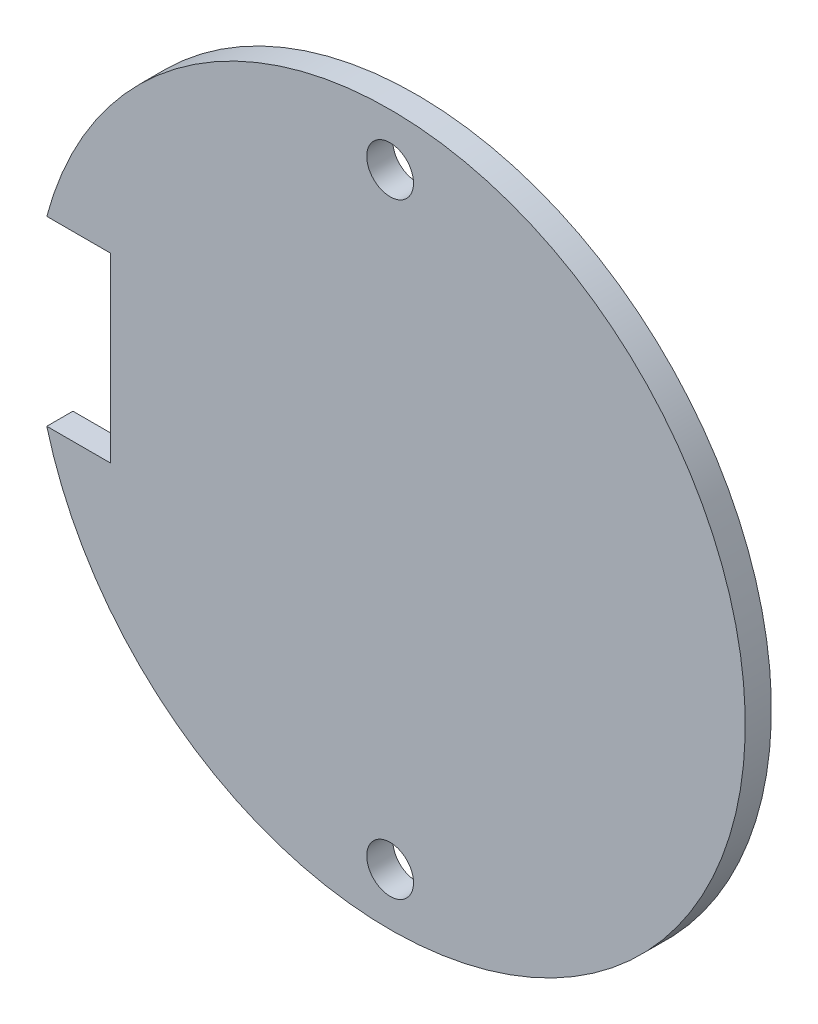
ISO-10303-21;
HEADER;
FILE_DESCRIPTION(('STEP AP214'),'2;1');
FILE_NAME('part.step','',(''),(''),'','','');
FILE_SCHEMA(('AUTOMOTIVE_DESIGN { 1 0 10303 214 1 1 1 1 }'));
ENDSEC;
DATA;
#1=APPLICATION_CONTEXT('core data for automotive mechanical design processes');
#2=APPLICATION_PROTOCOL_DEFINITION('international standard','automotive_design',2000,#1);
#3=PRODUCT_CONTEXT('',#1,'mechanical');
#4=PRODUCT('Part','Part','',(#3));
#5=PRODUCT_RELATED_PRODUCT_CATEGORY('part','',(#4));
#6=PRODUCT_DEFINITION_FORMATION('','',#4);
#7=PRODUCT_DEFINITION_CONTEXT('part definition',#1,'design');
#8=PRODUCT_DEFINITION('design','',#6,#7);
#9=PRODUCT_DEFINITION_SHAPE('','',#8);
#10=(LENGTH_UNIT() NAMED_UNIT(*) SI_UNIT(.MILLI.,.METRE.));
#11=(NAMED_UNIT(*) PLANE_ANGLE_UNIT() SI_UNIT($,.RADIAN.));
#12=(NAMED_UNIT(*) SI_UNIT($,.STERADIAN.) SOLID_ANGLE_UNIT());
#13=UNCERTAINTY_MEASURE_WITH_UNIT(LENGTH_MEASURE(1.E-05),#10,'distance_accuracy_value','');
#14=(GEOMETRIC_REPRESENTATION_CONTEXT(3) GLOBAL_UNCERTAINTY_ASSIGNED_CONTEXT((#13)) GLOBAL_UNIT_ASSIGNED_CONTEXT((#10,
#11,#12)) REPRESENTATION_CONTEXT('',''));
#15=CARTESIAN_POINT('',(0.,0.,0.));
#16=DIRECTION('',(0.,0.,1.));
#17=DIRECTION('',(1.,0.,0.));
#18=AXIS2_PLACEMENT_3D('',#15,#16,#17);
#19=CARTESIAN_POINT('',(0.,0.,1.5875));
#20=DIRECTION('',(0.,0.,1.));
#21=DIRECTION('',(1.,0.,0.));
#22=AXIS2_PLACEMENT_3D('',#19,#20,#21);
#23=PLANE('',#22);
#24=CARTESIAN_POINT('',(0.,18.415,1.5875));
#25=DIRECTION('',(0.,0.,1.));
#26=DIRECTION('',(1.,0.,0.));
#27=AXIS2_PLACEMENT_3D('',#24,#25,#26);
#28=CIRCLE('',#27,1.4224);
#29=CARTESIAN_POINT('',(1.42240000000001,18.415,1.5875));
#30=VERTEX_POINT('',#29);
#31=EDGE_CURVE('E100',#30,#30,#28,.T.);
#32=ORIENTED_EDGE('',*,*,#31,.F.);
#33=EDGE_LOOP('',(#32));
#34=FACE_BOUND('',#33,.T.);
#35=CARTESIAN_POINT('',(0.,0.,1.5875));
#36=DIRECTION('',(0.,0.,1.));
#37=DIRECTION('',(1.,0.,0.));
#38=AXIS2_PLACEMENT_3D('',#35,#36,#37);
#39=CIRCLE('',#38,21.59);
#40=CARTESIAN_POINT('',(-20.8712242034338,-5.52449999999999,1.5875));
#41=VERTEX_POINT('',#40);
#42=CARTESIAN_POINT('',(-20.8712242034338,5.5245,1.5875));
#43=VERTEX_POINT('',#42);
#44=EDGE_CURVE('E85',#41,#43,#39,.T.);
#45=ORIENTED_EDGE('',*,*,#44,.T.);
#46=DIRECTION('',(1.,0.,0.));
#47=VECTOR('',#46,1.);
#48=CARTESIAN_POINT('',(-20.8712242034338,5.5245,1.5875));
#49=LINE('',#48,#47);
#50=CARTESIAN_POINT('',(-16.9840587441892,5.5245,1.5875));
#51=VERTEX_POINT('',#50);
#52=EDGE_CURVE('E80',#43,#51,#49,.T.);
#53=ORIENTED_EDGE('',*,*,#52,.T.);
#54=DIRECTION('',(0.,-1.,0.));
#55=VECTOR('',#54,1.);
#56=CARTESIAN_POINT('',(-16.9840587441892,5.5245,1.5875));
#57=LINE('',#56,#55);
#58=CARTESIAN_POINT('',(-16.9840587441892,-5.5245,1.5875));
#59=VERTEX_POINT('',#58);
#60=EDGE_CURVE('E83',#51,#59,#57,.T.);
#61=ORIENTED_EDGE('',*,*,#60,.T.);
#62=DIRECTION('',(-1.,0.,0.));
#63=VECTOR('',#62,1.);
#64=CARTESIAN_POINT('',(-16.9840587441892,-5.5245,1.5875));
#65=LINE('',#64,#63);
#66=EDGE_CURVE('E50',#59,#41,#65,.T.);
#67=ORIENTED_EDGE('',*,*,#66,.T.);
#68=EDGE_LOOP('',(#45,#53,#61,#67));
#69=FACE_BOUND('',#68,.T.);
#70=CARTESIAN_POINT('',(0.,-18.415,1.5875));
#71=DIRECTION('',(0.,0.,1.));
#72=DIRECTION('',(1.,0.,0.));
#73=AXIS2_PLACEMENT_3D('',#70,#71,#72);
#74=CIRCLE('',#73,1.4224);
#75=CARTESIAN_POINT('',(1.42240000000001,-18.415,1.5875));
#76=VERTEX_POINT('',#75);
#77=EDGE_CURVE('E115',#76,#76,#74,.T.);
#78=ORIENTED_EDGE('',*,*,#77,.F.);
#79=EDGE_LOOP('',(#78));
#80=FACE_BOUND('',#79,.T.);
#81=ADVANCED_FACE('F33',(#34,#69,#80),#23,.T.);
#82=CARTESIAN_POINT('',(0.,0.,0.));
#83=DIRECTION('',(0.,0.,1.));
#84=DIRECTION('',(1.,0.,0.));
#85=AXIS2_PLACEMENT_3D('',#82,#83,#84);
#86=PLANE('',#85);
#87=CARTESIAN_POINT('',(0.,18.415,0.));
#88=DIRECTION('',(0.,0.,1.));
#89=DIRECTION('',(1.,0.,0.));
#90=AXIS2_PLACEMENT_3D('',#87,#88,#89);
#91=CIRCLE('',#90,1.4224);
#92=CARTESIAN_POINT('',(1.42240000000001,18.415,0.));
#93=VERTEX_POINT('',#92);
#94=EDGE_CURVE('E112',#93,#93,#91,.T.);
#95=ORIENTED_EDGE('',*,*,#94,.T.);
#96=EDGE_LOOP('',(#95));
#97=FACE_BOUND('',#96,.T.);
#98=CARTESIAN_POINT('',(0.,0.,0.));
#99=DIRECTION('',(0.,0.,1.));
#100=DIRECTION('',(1.,0.,0.));
#101=AXIS2_PLACEMENT_3D('',#98,#99,#100);
#102=CIRCLE('',#101,21.59);
#103=CARTESIAN_POINT('',(-20.8712242034338,-5.52449999999999,0.));
#104=VERTEX_POINT('',#103);
#105=CARTESIAN_POINT('',(-20.8712242034338,5.5245,0.));
#106=VERTEX_POINT('',#105);
#107=EDGE_CURVE('E97',#104,#106,#102,.T.);
#108=ORIENTED_EDGE('',*,*,#107,.F.);
#109=DIRECTION('',(-1.,0.,0.));
#110=VECTOR('',#109,1.);
#111=CARTESIAN_POINT('',(-16.9840587441892,-5.5245,0.));
#112=LINE('',#111,#110);
#113=CARTESIAN_POINT('',(-16.9840587441892,-5.5245,0.));
#114=VERTEX_POINT('',#113);
#115=EDGE_CURVE('E73',#114,#104,#112,.T.);
#116=ORIENTED_EDGE('',*,*,#115,.F.);
#117=DIRECTION('',(0.,-1.,0.));
#118=VECTOR('',#117,1.);
#119=CARTESIAN_POINT('',(-16.9840587441892,5.5245,0.));
#120=LINE('',#119,#118);
#121=CARTESIAN_POINT('',(-16.9840587441892,5.5245,0.));
#122=VERTEX_POINT('',#121);
#123=EDGE_CURVE('E67',#122,#114,#120,.T.);
#124=ORIENTED_EDGE('',*,*,#123,.F.);
#125=DIRECTION('',(1.,0.,0.));
#126=VECTOR('',#125,1.);
#127=CARTESIAN_POINT('',(-20.8712242034338,5.5245,0.));
#128=LINE('',#127,#126);
#129=EDGE_CURVE('E89',#106,#122,#128,.T.);
#130=ORIENTED_EDGE('',*,*,#129,.F.);
#131=EDGE_LOOP('',(#108,#116,#124,#130));
#132=FACE_BOUND('',#131,.T.);
#133=CARTESIAN_POINT('',(0.,-18.415,0.));
#134=DIRECTION('',(0.,0.,1.));
#135=DIRECTION('',(1.,0.,0.));
#136=AXIS2_PLACEMENT_3D('',#133,#134,#135);
#137=CIRCLE('',#136,1.4224);
#138=CARTESIAN_POINT('',(1.42240000000001,-18.415,0.));
#139=VERTEX_POINT('',#138);
#140=EDGE_CURVE('E118',#139,#139,#137,.T.);
#141=ORIENTED_EDGE('',*,*,#140,.T.);
#142=EDGE_LOOP('',(#141));
#143=FACE_BOUND('',#142,.T.);
#144=ADVANCED_FACE('F108',(#97,#132,#143),#86,.F.);
#145=CARTESIAN_POINT('',(0.,0.,1.5875));
#146=DIRECTION('',(0.,0.,-1.));
#147=DIRECTION('',(-1.,0.,0.));
#148=AXIS2_PLACEMENT_3D('',#145,#146,#147);
#149=CYLINDRICAL_SURFACE('',#148,21.59);
#150=ORIENTED_EDGE('',*,*,#107,.T.);
#151=DIRECTION('',(0.,0.,-1.));
#152=VECTOR('',#151,1.);
#153=CARTESIAN_POINT('',(-20.8712242034338,5.5245,1.5875));
#154=LINE('',#153,#152);
#155=EDGE_CURVE('E11',#43,#106,#154,.T.);
#156=ORIENTED_EDGE('',*,*,#155,.F.);
#157=ORIENTED_EDGE('',*,*,#44,.F.);
#158=DIRECTION('',(0.,0.,-1.));
#159=VECTOR('',#158,1.);
#160=CARTESIAN_POINT('',(-20.8712242034338,-5.52449999999999,1.5875));
#161=LINE('',#160,#159);
#162=EDGE_CURVE('E93',#41,#104,#161,.T.);
#163=ORIENTED_EDGE('',*,*,#162,.T.);
#164=EDGE_LOOP('',(#150,#156,#157,#163));
#165=FACE_BOUND('',#164,.T.);
#166=ADVANCED_FACE('F35',(#165),#149,.T.);
#167=CARTESIAN_POINT('',(-20.8712242034338,5.5245,1.5875));
#168=DIRECTION('',(0.,1.,0.));
#169=DIRECTION('',(0.,0.,1.));
#170=AXIS2_PLACEMENT_3D('',#167,#168,#169);
#171=PLANE('',#170);
#172=ORIENTED_EDGE('',*,*,#129,.T.);
#173=DIRECTION('',(0.,0.,-1.));
#174=VECTOR('',#173,1.);
#175=CARTESIAN_POINT('',(-16.9840587441892,5.5245,1.5875));
#176=LINE('',#175,#174);
#177=EDGE_CURVE('E42',#51,#122,#176,.T.);
#178=ORIENTED_EDGE('',*,*,#177,.F.);
#179=ORIENTED_EDGE('',*,*,#52,.F.);
#180=ORIENTED_EDGE('',*,*,#155,.T.);
#181=EDGE_LOOP('',(#172,#178,#179,#180));
#182=FACE_BOUND('',#181,.T.);
#183=ADVANCED_FACE('F88',(#182),#171,.F.);
#184=CARTESIAN_POINT('',(-16.9840587441892,5.5245,1.5875));
#185=DIRECTION('',(1.,0.,0.));
#186=DIRECTION('',(0.,0.,-1.));
#187=AXIS2_PLACEMENT_3D('',#184,#185,#186);
#188=PLANE('',#187);
#189=ORIENTED_EDGE('',*,*,#123,.T.);
#190=DIRECTION('',(0.,0.,-1.));
#191=VECTOR('',#190,1.);
#192=CARTESIAN_POINT('',(-16.9840587441892,-5.5245,1.5875));
#193=LINE('',#192,#191);
#194=EDGE_CURVE('E90',#59,#114,#193,.T.);
#195=ORIENTED_EDGE('',*,*,#194,.F.);
#196=ORIENTED_EDGE('',*,*,#60,.F.);
#197=ORIENTED_EDGE('',*,*,#177,.T.);
#198=EDGE_LOOP('',(#189,#195,#196,#197));
#199=FACE_BOUND('',#198,.T.);
#200=ADVANCED_FACE('F91',(#199),#188,.F.);
#201=CARTESIAN_POINT('',(-16.9840587441892,-5.5245,1.5875));
#202=DIRECTION('',(0.,-1.,0.));
#203=DIRECTION('',(1.,0.,0.));
#204=AXIS2_PLACEMENT_3D('',#201,#202,#203);
#205=PLANE('',#204);
#206=ORIENTED_EDGE('',*,*,#115,.T.);
#207=ORIENTED_EDGE('',*,*,#162,.F.);
#208=ORIENTED_EDGE('',*,*,#66,.F.);
#209=ORIENTED_EDGE('',*,*,#194,.T.);
#210=EDGE_LOOP('',(#206,#207,#208,#209));
#211=FACE_BOUND('',#210,.T.);
#212=ADVANCED_FACE('F105',(#211),#205,.F.);
#213=CARTESIAN_POINT('',(0.,18.415,1.5875));
#214=DIRECTION('',(0.,0.,-1.));
#215=DIRECTION('',(-1.,0.,0.));
#216=AXIS2_PLACEMENT_3D('',#213,#214,#215);
#217=CYLINDRICAL_SURFACE('',#216,1.4224);
#218=ORIENTED_EDGE('',*,*,#31,.T.);
#219=EDGE_LOOP('',(#218));
#220=FACE_BOUND('',#219,.T.);
#221=ORIENTED_EDGE('',*,*,#94,.F.);
#222=EDGE_LOOP('',(#221));
#223=FACE_BOUND('',#222,.T.);
#224=ADVANCED_FACE('F136',(#220,#223),#217,.F.);
#225=CARTESIAN_POINT('',(0.,-18.415,1.5875));
#226=DIRECTION('',(0.,0.,-1.));
#227=DIRECTION('',(-1.,0.,0.));
#228=AXIS2_PLACEMENT_3D('',#225,#226,#227);
#229=CYLINDRICAL_SURFACE('',#228,1.4224);
#230=ORIENTED_EDGE('',*,*,#77,.T.);
#231=EDGE_LOOP('',(#230));
#232=FACE_BOUND('',#231,.T.);
#233=ORIENTED_EDGE('',*,*,#140,.F.);
#234=EDGE_LOOP('',(#233));
#235=FACE_BOUND('',#234,.T.);
#236=ADVANCED_FACE('F124',(#232,#235),#229,.F.);
#237=CLOSED_SHELL('',(#81,#144,#166,#183,#200,#212,#224,#236));
#238=MANIFOLD_SOLID_BREP('B2',#237);
#239=ADVANCED_BREP_SHAPE_REPRESENTATION('',(#18,#238),#14);
#240=SHAPE_DEFINITION_REPRESENTATION(#9,#239);
ENDSEC;
END-ISO-10303-21;
